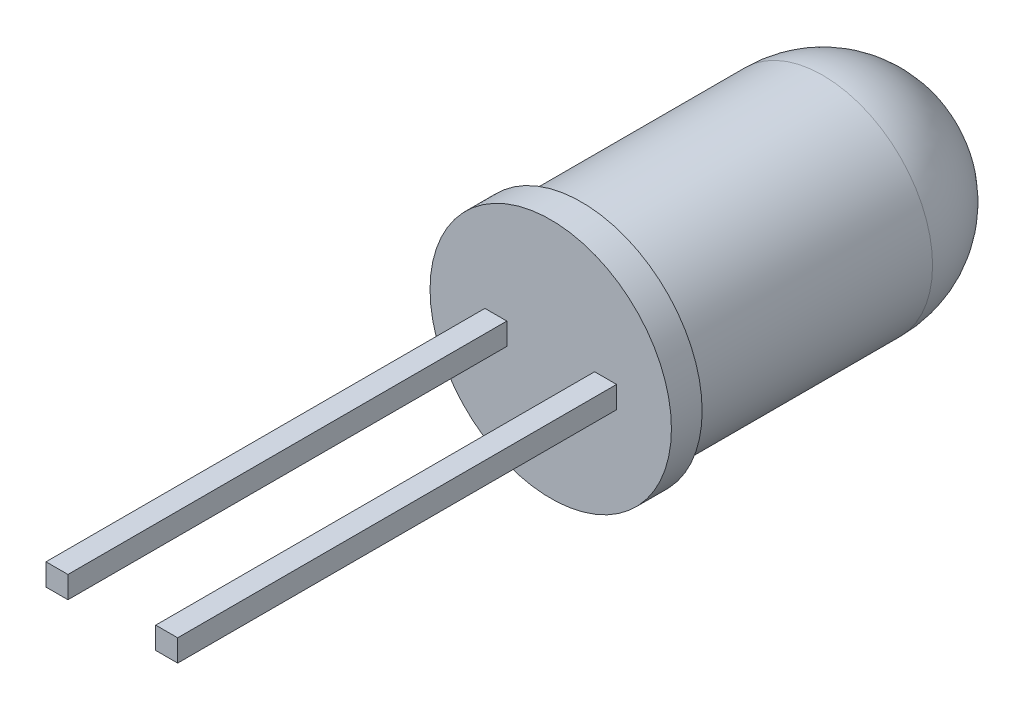
ISO-10303-21;
HEADER;
FILE_DESCRIPTION(('STEP AP214'),'2;1');
FILE_NAME('part.step','',(''),(''),'','','');
FILE_SCHEMA(('AUTOMOTIVE_DESIGN { 1 0 10303 214 1 1 1 1 }'));
ENDSEC;
DATA;
#1=APPLICATION_CONTEXT('core data for automotive mechanical design processes');
#2=APPLICATION_PROTOCOL_DEFINITION('international standard','automotive_design',2000,#1);
#3=PRODUCT_CONTEXT('',#1,'mechanical');
#4=PRODUCT('Part','Part','',(#3));
#5=PRODUCT_RELATED_PRODUCT_CATEGORY('part','',(#4));
#6=PRODUCT_DEFINITION_FORMATION('','',#4);
#7=PRODUCT_DEFINITION_CONTEXT('part definition',#1,'design');
#8=PRODUCT_DEFINITION('design','',#6,#7);
#9=PRODUCT_DEFINITION_SHAPE('','',#8);
#10=(LENGTH_UNIT() NAMED_UNIT(*) SI_UNIT(.MILLI.,.METRE.));
#11=(NAMED_UNIT(*) PLANE_ANGLE_UNIT() SI_UNIT($,.RADIAN.));
#12=(NAMED_UNIT(*) SI_UNIT($,.STERADIAN.) SOLID_ANGLE_UNIT());
#13=UNCERTAINTY_MEASURE_WITH_UNIT(LENGTH_MEASURE(1.E-05),#10,'distance_accuracy_value','');
#14=(GEOMETRIC_REPRESENTATION_CONTEXT(3) GLOBAL_UNCERTAINTY_ASSIGNED_CONTEXT((#13)) GLOBAL_UNIT_ASSIGNED_CONTEXT((#10,
#11,#12)) REPRESENTATION_CONTEXT('',''));
#15=CARTESIAN_POINT('',(0.,0.,0.));
#16=DIRECTION('',(0.,0.,1.));
#17=DIRECTION('',(1.,0.,0.));
#18=AXIS2_PLACEMENT_3D('',#15,#16,#17);
#19=CARTESIAN_POINT('',(0.,0.,8.7));
#20=DIRECTION('',(0.,0.,1.));
#21=DIRECTION('',(1.,0.,0.));
#22=AXIS2_PLACEMENT_3D('',#19,#20,#21);
#23=PLANE('',#22);
#24=CARTESIAN_POINT('',(0.,0.,8.7));
#25=DIRECTION('',(0.,0.,1.));
#26=DIRECTION('',(1.,0.,0.));
#27=AXIS2_PLACEMENT_3D('',#24,#25,#26);
#28=CIRCLE('',#27,2.75);
#29=CARTESIAN_POINT('',(2.75,0.,8.7));
#30=VERTEX_POINT('',#29);
#31=EDGE_CURVE('E179',#30,#30,#28,.T.);
#32=ORIENTED_EDGE('',*,*,#31,.T.);
#33=EDGE_LOOP('',(#32));
#34=FACE_BOUND('',#33,.T.);
#35=DIRECTION('',(1.,0.,0.));
#36=VECTOR('',#35,1.);
#37=CARTESIAN_POINT('',(-1.5,-0.25,8.7));
#38=LINE('',#37,#36);
#39=CARTESIAN_POINT('',(-1.5,-0.25,8.7));
#40=VERTEX_POINT('',#39);
#41=CARTESIAN_POINT('',(-1.,-0.25,8.7));
#42=VERTEX_POINT('',#41);
#43=EDGE_CURVE('E139',#40,#42,#38,.T.);
#44=ORIENTED_EDGE('',*,*,#43,.F.);
#45=DIRECTION('',(0.,-1.,0.));
#46=VECTOR('',#45,1.);
#47=CARTESIAN_POINT('',(-1.5,0.25,8.7));
#48=LINE('',#47,#46);
#49=CARTESIAN_POINT('',(-1.5,0.25,8.7));
#50=VERTEX_POINT('',#49);
#51=EDGE_CURVE('E134',#50,#40,#48,.T.);
#52=ORIENTED_EDGE('',*,*,#51,.F.);
#53=DIRECTION('',(-1.,0.,0.));
#54=VECTOR('',#53,1.);
#55=CARTESIAN_POINT('',(-1.5,0.25,8.7));
#56=LINE('',#55,#54);
#57=CARTESIAN_POINT('',(-1.,0.25,8.7));
#58=VERTEX_POINT('',#57);
#59=EDGE_CURVE('E149',#58,#50,#56,.T.);
#60=ORIENTED_EDGE('',*,*,#59,.F.);
#61=DIRECTION('',(0.,1.,0.));
#62=VECTOR('',#61,1.);
#63=CARTESIAN_POINT('',(-1.,0.25,8.7));
#64=LINE('',#63,#62);
#65=EDGE_CURVE('E161',#42,#58,#64,.T.);
#66=ORIENTED_EDGE('',*,*,#65,.F.);
#67=EDGE_LOOP('',(#44,#52,#60,#66));
#68=FACE_BOUND('',#67,.T.);
#69=DIRECTION('',(1.,0.,0.));
#70=VECTOR('',#69,1.);
#71=CARTESIAN_POINT('',(1.,-0.25,8.7));
#72=LINE('',#71,#70);
#73=CARTESIAN_POINT('',(1.,-0.25,8.7));
#74=VERTEX_POINT('',#73);
#75=CARTESIAN_POINT('',(1.5,-0.25,8.7));
#76=VERTEX_POINT('',#75);
#77=EDGE_CURVE('E338',#74,#76,#72,.T.);
#78=ORIENTED_EDGE('',*,*,#77,.F.);
#79=DIRECTION('',(0.,-1.,0.));
#80=VECTOR('',#79,1.);
#81=CARTESIAN_POINT('',(1.,0.25,8.7));
#82=LINE('',#81,#80);
#83=CARTESIAN_POINT('',(1.,0.25,8.7));
#84=VERTEX_POINT('',#83);
#85=EDGE_CURVE('E131',#84,#74,#82,.T.);
#86=ORIENTED_EDGE('',*,*,#85,.F.);
#87=DIRECTION('',(-1.,0.,0.));
#88=VECTOR('',#87,1.);
#89=CARTESIAN_POINT('',(1.,0.25,8.7));
#90=LINE('',#89,#88);
#91=CARTESIAN_POINT('',(1.5,0.25,8.7));
#92=VERTEX_POINT('',#91);
#93=EDGE_CURVE('E127',#92,#84,#90,.T.);
#94=ORIENTED_EDGE('',*,*,#93,.F.);
#95=DIRECTION('',(0.,1.,0.));
#96=VECTOR('',#95,1.);
#97=CARTESIAN_POINT('',(1.5,0.25,8.7));
#98=LINE('',#97,#96);
#99=EDGE_CURVE('E334',#76,#92,#98,.T.);
#100=ORIENTED_EDGE('',*,*,#99,.F.);
#101=EDGE_LOOP('',(#78,#86,#94,#100));
#102=FACE_BOUND('',#101,.T.);
#103=ADVANCED_FACE('F39',(#34,#68,#102),#23,.T.);
#104=CARTESIAN_POINT('',(0.,0.,8.));
#105=DIRECTION('',(0.,0.,-1.));
#106=DIRECTION('',(-1.,0.,0.));
#107=AXIS2_PLACEMENT_3D('',#104,#105,#106);
#108=CYLINDRICAL_SURFACE('',#107,2.5);
#109=CARTESIAN_POINT('',(0.,0.,2.5));
#110=DIRECTION('',(0.,0.,-1.));
#111=DIRECTION('',(-1.,0.,0.));
#112=AXIS2_PLACEMENT_3D('',#109,#110,#111);
#113=CIRCLE('',#112,2.5);
#114=CARTESIAN_POINT('',(-2.5,0.,2.5));
#115=VERTEX_POINT('',#114);
#116=EDGE_CURVE('E11',#115,#115,#113,.F.);
#117=ORIENTED_EDGE('',*,*,#116,.T.);
#118=EDGE_LOOP('',(#117));
#119=FACE_BOUND('',#118,.T.);
#120=CARTESIAN_POINT('',(0.,0.,8.));
#121=DIRECTION('',(0.,0.,1.));
#122=DIRECTION('',(1.,0.,0.));
#123=AXIS2_PLACEMENT_3D('',#120,#121,#122);
#124=CIRCLE('',#123,2.5);
#125=CARTESIAN_POINT('',(2.5,0.,8.));
#126=VERTEX_POINT('',#125);
#127=EDGE_CURVE('E48',#126,#126,#124,.T.);
#128=ORIENTED_EDGE('',*,*,#127,.F.);
#129=EDGE_LOOP('',(#128));
#130=FACE_BOUND('',#129,.T.);
#131=ADVANCED_FACE('F192',(#119,#130),#108,.T.);
#132=CARTESIAN_POINT('',(0.,0.,8.7));
#133=DIRECTION('',(0.,0.,-1.));
#134=DIRECTION('',(-1.,0.,0.));
#135=AXIS2_PLACEMENT_3D('',#132,#133,#134);
#136=CYLINDRICAL_SURFACE('',#135,2.75);
#137=ORIENTED_EDGE('',*,*,#31,.F.);
#138=EDGE_LOOP('',(#137));
#139=FACE_BOUND('',#138,.T.);
#140=CARTESIAN_POINT('',(0.,0.,8.));
#141=DIRECTION('',(0.,0.,1.));
#142=DIRECTION('',(1.,0.,0.));
#143=AXIS2_PLACEMENT_3D('',#140,#141,#142);
#144=CIRCLE('',#143,2.75);
#145=CARTESIAN_POINT('',(2.75,0.,8.));
#146=VERTEX_POINT('',#145);
#147=EDGE_CURVE('E178',#146,#146,#144,.T.);
#148=ORIENTED_EDGE('',*,*,#147,.T.);
#149=EDGE_LOOP('',(#148));
#150=FACE_BOUND('',#149,.T.);
#151=ADVANCED_FACE('F194',(#139,#150),#136,.T.);
#152=CARTESIAN_POINT('',(0.,0.,8.));
#153=DIRECTION('',(0.,0.,1.));
#154=DIRECTION('',(1.,0.,0.));
#155=AXIS2_PLACEMENT_3D('',#152,#153,#154);
#156=PLANE('',#155);
#157=ORIENTED_EDGE('',*,*,#127,.T.);
#158=EDGE_LOOP('',(#157));
#159=FACE_BOUND('',#158,.T.);
#160=ORIENTED_EDGE('',*,*,#147,.F.);
#161=EDGE_LOOP('',(#160));
#162=FACE_BOUND('',#161,.T.);
#163=ADVANCED_FACE('F189',(#159,#162),#156,.F.);
#164=CARTESIAN_POINT('',(-1.5,0.25,18.7));
#165=DIRECTION('',(1.,0.,0.));
#166=DIRECTION('',(0.,0.,-1.));
#167=AXIS2_PLACEMENT_3D('',#164,#165,#166);
#168=PLANE('',#167);
#169=ORIENTED_EDGE('',*,*,#51,.T.);
#170=DIRECTION('',(0.,0.,-1.));
#171=VECTOR('',#170,1.);
#172=CARTESIAN_POINT('',(-1.5,-0.25,18.7));
#173=LINE('',#172,#171);
#174=CARTESIAN_POINT('',(-1.5,-0.25,18.7));
#175=VERTEX_POINT('',#174);
#176=EDGE_CURVE('E175',#175,#40,#173,.T.);
#177=ORIENTED_EDGE('',*,*,#176,.F.);
#178=DIRECTION('',(0.,-1.,0.));
#179=VECTOR('',#178,1.);
#180=CARTESIAN_POINT('',(-1.5,0.25,18.7));
#181=LINE('',#180,#179);
#182=CARTESIAN_POINT('',(-1.5,0.25,18.7));
#183=VERTEX_POINT('',#182);
#184=EDGE_CURVE('E144',#183,#175,#181,.T.);
#185=ORIENTED_EDGE('',*,*,#184,.F.);
#186=DIRECTION('',(0.,0.,-1.));
#187=VECTOR('',#186,1.);
#188=CARTESIAN_POINT('',(-1.5,0.25,18.7));
#189=LINE('',#188,#187);
#190=EDGE_CURVE('E157',#183,#50,#189,.T.);
#191=ORIENTED_EDGE('',*,*,#190,.T.);
#192=EDGE_LOOP('',(#169,#177,#185,#191));
#193=FACE_BOUND('',#192,.T.);
#194=ADVANCED_FACE('F206',(#193),#168,.F.);
#195=CARTESIAN_POINT('',(-1.5,-0.25,18.7));
#196=DIRECTION('',(0.,1.,0.));
#197=DIRECTION('',(-1.,0.,0.));
#198=AXIS2_PLACEMENT_3D('',#195,#196,#197);
#199=PLANE('',#198);
#200=ORIENTED_EDGE('',*,*,#43,.T.);
#201=DIRECTION('',(0.,0.,-1.));
#202=VECTOR('',#201,1.);
#203=CARTESIAN_POINT('',(-1.,-0.25,18.7));
#204=LINE('',#203,#202);
#205=CARTESIAN_POINT('',(-1.,-0.25,18.7));
#206=VERTEX_POINT('',#205);
#207=EDGE_CURVE('E171',#206,#42,#204,.T.);
#208=ORIENTED_EDGE('',*,*,#207,.F.);
#209=DIRECTION('',(1.,0.,0.));
#210=VECTOR('',#209,1.);
#211=CARTESIAN_POINT('',(-1.5,-0.25,18.7));
#212=LINE('',#211,#210);
#213=EDGE_CURVE('E148',#175,#206,#212,.T.);
#214=ORIENTED_EDGE('',*,*,#213,.F.);
#215=ORIENTED_EDGE('',*,*,#176,.T.);
#216=EDGE_LOOP('',(#200,#208,#214,#215));
#217=FACE_BOUND('',#216,.T.);
#218=ADVANCED_FACE('F210',(#217),#199,.F.);
#219=CARTESIAN_POINT('',(-1.,0.25,18.7));
#220=DIRECTION('',(-1.,0.,0.));
#221=DIRECTION('',(0.,-1.,0.));
#222=AXIS2_PLACEMENT_3D('',#219,#220,#221);
#223=PLANE('',#222);
#224=ORIENTED_EDGE('',*,*,#65,.T.);
#225=DIRECTION('',(0.,0.,-1.));
#226=VECTOR('',#225,1.);
#227=CARTESIAN_POINT('',(-1.,0.25,18.7));
#228=LINE('',#227,#226);
#229=CARTESIAN_POINT('',(-1.,0.25,18.7));
#230=VERTEX_POINT('',#229);
#231=EDGE_CURVE('E63',#230,#58,#228,.T.);
#232=ORIENTED_EDGE('',*,*,#231,.F.);
#233=DIRECTION('',(0.,1.,0.));
#234=VECTOR('',#233,1.);
#235=CARTESIAN_POINT('',(-1.,0.25,18.7));
#236=LINE('',#235,#234);
#237=EDGE_CURVE('E152',#206,#230,#236,.T.);
#238=ORIENTED_EDGE('',*,*,#237,.F.);
#239=ORIENTED_EDGE('',*,*,#207,.T.);
#240=EDGE_LOOP('',(#224,#232,#238,#239));
#241=FACE_BOUND('',#240,.T.);
#242=ADVANCED_FACE('F214',(#241),#223,.F.);
#243=CARTESIAN_POINT('',(-1.5,0.25,18.7));
#244=DIRECTION('',(0.,-1.,0.));
#245=DIRECTION('',(1.,0.,0.));
#246=AXIS2_PLACEMENT_3D('',#243,#244,#245);
#247=PLANE('',#246);
#248=ORIENTED_EDGE('',*,*,#59,.T.);
#249=ORIENTED_EDGE('',*,*,#190,.F.);
#250=DIRECTION('',(-1.,0.,0.));
#251=VECTOR('',#250,1.);
#252=CARTESIAN_POINT('',(-1.5,0.25,18.7));
#253=LINE('',#252,#251);
#254=EDGE_CURVE('E155',#230,#183,#253,.T.);
#255=ORIENTED_EDGE('',*,*,#254,.F.);
#256=ORIENTED_EDGE('',*,*,#231,.T.);
#257=EDGE_LOOP('',(#248,#249,#255,#256));
#258=FACE_BOUND('',#257,.T.);
#259=ADVANCED_FACE('F218',(#258),#247,.F.);
#260=CARTESIAN_POINT('',(0.,0.,18.7));
#261=DIRECTION('',(0.,0.,1.));
#262=DIRECTION('',(1.,0.,0.));
#263=AXIS2_PLACEMENT_3D('',#260,#261,#262);
#264=PLANE('',#263);
#265=ORIENTED_EDGE('',*,*,#184,.T.);
#266=ORIENTED_EDGE('',*,*,#213,.T.);
#267=ORIENTED_EDGE('',*,*,#237,.T.);
#268=ORIENTED_EDGE('',*,*,#254,.T.);
#269=EDGE_LOOP('',(#265,#266,#267,#268));
#270=FACE_BOUND('',#269,.T.);
#271=ADVANCED_FACE('F222',(#270),#264,.T.);
#272=CARTESIAN_POINT('',(1.,0.25,18.7));
#273=DIRECTION('',(1.,0.,0.));
#274=DIRECTION('',(0.,0.,-1.));
#275=AXIS2_PLACEMENT_3D('',#272,#273,#274);
#276=PLANE('',#275);
#277=ORIENTED_EDGE('',*,*,#85,.T.);
#278=DIRECTION('',(0.,0.,-1.));
#279=VECTOR('',#278,1.);
#280=CARTESIAN_POINT('',(1.,-0.25,18.7));
#281=LINE('',#280,#279);
#282=CARTESIAN_POINT('',(1.,-0.25,18.7));
#283=VERTEX_POINT('',#282);
#284=EDGE_CURVE('E110',#283,#74,#281,.T.);
#285=ORIENTED_EDGE('',*,*,#284,.F.);
#286=DIRECTION('',(0.,-1.,0.));
#287=VECTOR('',#286,1.);
#288=CARTESIAN_POINT('',(1.,0.25,18.7));
#289=LINE('',#288,#287);
#290=CARTESIAN_POINT('',(1.,0.25,18.7));
#291=VERTEX_POINT('',#290);
#292=EDGE_CURVE('E118',#291,#283,#289,.T.);
#293=ORIENTED_EDGE('',*,*,#292,.F.);
#294=DIRECTION('',(0.,0.,-1.));
#295=VECTOR('',#294,1.);
#296=CARTESIAN_POINT('',(1.,0.25,18.7));
#297=LINE('',#296,#295);
#298=EDGE_CURVE('E330',#291,#84,#297,.T.);
#299=ORIENTED_EDGE('',*,*,#298,.T.);
#300=EDGE_LOOP('',(#277,#285,#293,#299));
#301=FACE_BOUND('',#300,.T.);
#302=ADVANCED_FACE('F129',(#301),#276,.F.);
#303=CARTESIAN_POINT('',(1.,-0.25,18.7));
#304=DIRECTION('',(0.,1.,0.));
#305=DIRECTION('',(0.,0.,1.));
#306=AXIS2_PLACEMENT_3D('',#303,#304,#305);
#307=PLANE('',#306);
#308=ORIENTED_EDGE('',*,*,#77,.T.);
#309=DIRECTION('',(0.,0.,-1.));
#310=VECTOR('',#309,1.);
#311=CARTESIAN_POINT('',(1.5,-0.25,18.7));
#312=LINE('',#311,#310);
#313=CARTESIAN_POINT('',(1.5,-0.25,18.7));
#314=VERTEX_POINT('',#313);
#315=EDGE_CURVE('E113',#314,#76,#312,.T.);
#316=ORIENTED_EDGE('',*,*,#315,.F.);
#317=DIRECTION('',(1.,0.,0.));
#318=VECTOR('',#317,1.);
#319=CARTESIAN_POINT('',(1.,-0.25,18.7));
#320=LINE('',#319,#318);
#321=EDGE_CURVE('E106',#283,#314,#320,.T.);
#322=ORIENTED_EDGE('',*,*,#321,.F.);
#323=ORIENTED_EDGE('',*,*,#284,.T.);
#324=EDGE_LOOP('',(#308,#316,#322,#323));
#325=FACE_BOUND('',#324,.T.);
#326=ADVANCED_FACE('F108',(#325),#307,.F.);
#327=CARTESIAN_POINT('',(1.5,0.25,18.7));
#328=DIRECTION('',(-1.,0.,0.));
#329=DIRECTION('',(0.,-1.,0.));
#330=AXIS2_PLACEMENT_3D('',#327,#328,#329);
#331=PLANE('',#330);
#332=ORIENTED_EDGE('',*,*,#99,.T.);
#333=DIRECTION('',(0.,0.,-1.));
#334=VECTOR('',#333,1.);
#335=CARTESIAN_POINT('',(1.5,0.25,18.7));
#336=LINE('',#335,#334);
#337=CARTESIAN_POINT('',(1.5,0.25,18.7));
#338=VERTEX_POINT('',#337);
#339=EDGE_CURVE('E55',#338,#92,#336,.T.);
#340=ORIENTED_EDGE('',*,*,#339,.F.);
#341=DIRECTION('',(0.,1.,0.));
#342=VECTOR('',#341,1.);
#343=CARTESIAN_POINT('',(1.5,0.25,18.7));
#344=LINE('',#343,#342);
#345=EDGE_CURVE('E117',#314,#338,#344,.T.);
#346=ORIENTED_EDGE('',*,*,#345,.F.);
#347=ORIENTED_EDGE('',*,*,#315,.T.);
#348=EDGE_LOOP('',(#332,#340,#346,#347));
#349=FACE_BOUND('',#348,.T.);
#350=ADVANCED_FACE('F230',(#349),#331,.F.);
#351=CARTESIAN_POINT('',(1.,0.25,18.7));
#352=DIRECTION('',(0.,-1.,0.));
#353=DIRECTION('',(1.,0.,0.));
#354=AXIS2_PLACEMENT_3D('',#351,#352,#353);
#355=PLANE('',#354);
#356=ORIENTED_EDGE('',*,*,#93,.T.);
#357=ORIENTED_EDGE('',*,*,#298,.F.);
#358=DIRECTION('',(-1.,0.,0.));
#359=VECTOR('',#358,1.);
#360=CARTESIAN_POINT('',(1.,0.25,18.7));
#361=LINE('',#360,#359);
#362=EDGE_CURVE('E122',#338,#291,#361,.T.);
#363=ORIENTED_EDGE('',*,*,#362,.F.);
#364=ORIENTED_EDGE('',*,*,#339,.T.);
#365=EDGE_LOOP('',(#356,#357,#363,#364));
#366=FACE_BOUND('',#365,.T.);
#367=ADVANCED_FACE('F233',(#366),#355,.F.);
#368=CARTESIAN_POINT('',(0.,0.,18.7));
#369=DIRECTION('',(0.,0.,1.));
#370=DIRECTION('',(1.,0.,0.));
#371=AXIS2_PLACEMENT_3D('',#368,#369,#370);
#372=PLANE('',#371);
#373=ORIENTED_EDGE('',*,*,#292,.T.);
#374=ORIENTED_EDGE('',*,*,#321,.T.);
#375=ORIENTED_EDGE('',*,*,#345,.T.);
#376=ORIENTED_EDGE('',*,*,#362,.T.);
#377=EDGE_LOOP('',(#373,#374,#375,#376));
#378=FACE_BOUND('',#377,.T.);
#379=ADVANCED_FACE('F121',(#378),#372,.T.);
#380=CARTESIAN_POINT('',(0.,0.,2.5));
#381=DIRECTION('',(0.,0.,1.));
#382=DIRECTION('',(1.,0.,0.));
#383=AXIS2_PLACEMENT_3D('',#380,#381,#382);
#384=SPHERICAL_SURFACE('',#383,2.5);
#385=ORIENTED_EDGE('',*,*,#116,.F.);
#386=EDGE_LOOP('',(#385));
#387=FACE_BOUND('',#386,.T.);
#388=ADVANCED_FACE('F41',(#387),#384,.T.);
#389=CLOSED_SHELL('',(#103,#131,#151,#163,#194,#218,#242,#259,#271,#302,#326,#350,#367,#379,#388));
#390=MANIFOLD_SOLID_BREP('B2',#389);
#391=ADVANCED_BREP_SHAPE_REPRESENTATION('',(#18,#390),#14);
#392=SHAPE_DEFINITION_REPRESENTATION(#9,#391);
ENDSEC;
END-ISO-10303-21;
